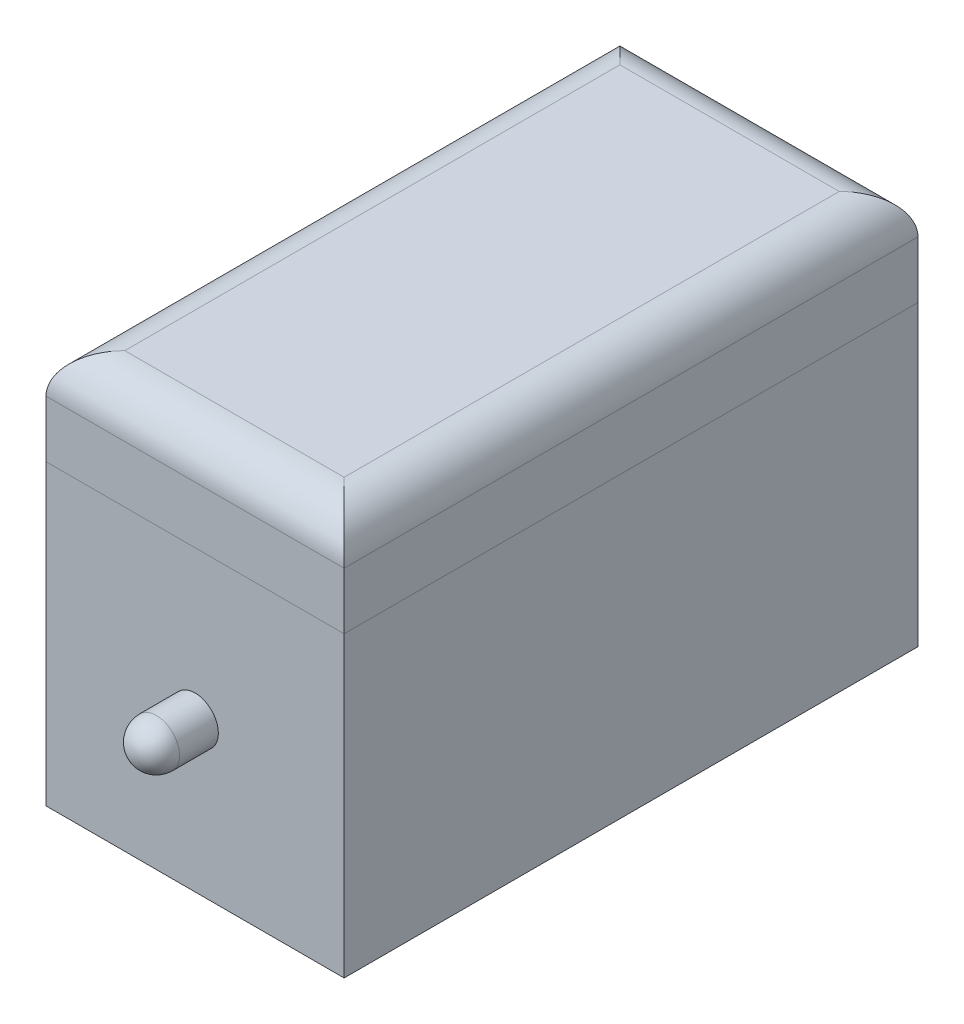
ISO-10303-21;
HEADER;
FILE_DESCRIPTION(('STEP AP214'),'2;1');
FILE_NAME('part.step','',(''),(''),'','','');
FILE_SCHEMA(('AUTOMOTIVE_DESIGN { 1 0 10303 214 1 1 1 1 }'));
ENDSEC;
DATA;
#1=APPLICATION_CONTEXT('core data for automotive mechanical design processes');
#2=APPLICATION_PROTOCOL_DEFINITION('international standard','automotive_design',2000,#1);
#3=PRODUCT_CONTEXT('',#1,'mechanical');
#4=PRODUCT('Part','Part','',(#3));
#5=PRODUCT_RELATED_PRODUCT_CATEGORY('part','',(#4));
#6=PRODUCT_DEFINITION_FORMATION('','',#4);
#7=PRODUCT_DEFINITION_CONTEXT('part definition',#1,'design');
#8=PRODUCT_DEFINITION('design','',#6,#7);
#9=PRODUCT_DEFINITION_SHAPE('','',#8);
#10=(LENGTH_UNIT() NAMED_UNIT(*) SI_UNIT(.MILLI.,.METRE.));
#11=(NAMED_UNIT(*) PLANE_ANGLE_UNIT() SI_UNIT($,.RADIAN.));
#12=(NAMED_UNIT(*) SI_UNIT($,.STERADIAN.) SOLID_ANGLE_UNIT());
#13=UNCERTAINTY_MEASURE_WITH_UNIT(LENGTH_MEASURE(1.E-05),#10,'distance_accuracy_value','');
#14=(GEOMETRIC_REPRESENTATION_CONTEXT(3) GLOBAL_UNCERTAINTY_ASSIGNED_CONTEXT((#13)) GLOBAL_UNIT_ASSIGNED_CONTEXT((#10,
#11,#12)) REPRESENTATION_CONTEXT('',''));
#15=CARTESIAN_POINT('',(0.,0.,0.));
#16=DIRECTION('',(0.,0.,1.));
#17=DIRECTION('',(1.,0.,0.));
#18=AXIS2_PLACEMENT_3D('',#15,#16,#17);
#19=CARTESIAN_POINT('',(9.60999999999999,15.81,37.));
#20=DIRECTION('',(-1.,0.,0.));
#21=DIRECTION('',(0.,0.,1.));
#22=AXIS2_PLACEMENT_3D('',#19,#20,#21);
#23=PLANE('',#22);
#24=DIRECTION('',(0.,-1.,0.));
#25=VECTOR('',#24,1.);
#26=CARTESIAN_POINT('',(9.60999999999999,15.81,0.));
#27=LINE('',#26,#25);
#28=CARTESIAN_POINT('',(9.60999999999999,13.27,0.));
#29=VERTEX_POINT('',#28);
#30=CARTESIAN_POINT('',(9.60999999999999,9.61,0.));
#31=VERTEX_POINT('',#30);
#32=EDGE_CURVE('E99',#29,#31,#27,.T.);
#33=ORIENTED_EDGE('',*,*,#32,.F.);
#34=DIRECTION('',(0.,0.,-1.));
#35=VECTOR('',#34,1.);
#36=CARTESIAN_POINT('',(9.60999999999999,13.27,37.));
#37=LINE('',#36,#35);
#38=CARTESIAN_POINT('',(9.60999999999999,13.27,37.));
#39=VERTEX_POINT('',#38);
#40=EDGE_CURVE('E12',#29,#39,#37,.F.);
#41=ORIENTED_EDGE('',*,*,#40,.T.);
#42=DIRECTION('',(0.,-1.,0.));
#43=VECTOR('',#42,1.);
#44=CARTESIAN_POINT('',(9.60999999999999,15.81,37.));
#45=LINE('',#44,#43);
#46=CARTESIAN_POINT('',(9.60999999999999,9.61,37.));
#47=VERTEX_POINT('',#46);
#48=EDGE_CURVE('E119',#39,#47,#45,.T.);
#49=ORIENTED_EDGE('',*,*,#48,.T.);
#50=DIRECTION('',(0.,0.,-1.));
#51=VECTOR('',#50,1.);
#52=CARTESIAN_POINT('',(9.60999999999999,9.61,37.));
#53=LINE('',#52,#51);
#54=EDGE_CURVE('E114',#47,#31,#53,.T.);
#55=ORIENTED_EDGE('',*,*,#54,.T.);
#56=EDGE_LOOP('',(#33,#41,#49,#55));
#57=FACE_BOUND('',#56,.T.);
#58=ADVANCED_FACE('F47',(#57),#23,.F.);
#59=CARTESIAN_POINT('',(9.60999999999999,15.81,0.));
#60=DIRECTION('',(0.,0.,1.));
#61=DIRECTION('',(1.,0.,0.));
#62=AXIS2_PLACEMENT_3D('',#59,#60,#61);
#63=PLANE('',#62);
#64=DIRECTION('',(0.,-1.,0.));
#65=VECTOR('',#64,1.);
#66=CARTESIAN_POINT('',(-9.61,15.81,0.));
#67=LINE('',#66,#65);
#68=CARTESIAN_POINT('',(-9.61,13.27,0.));
#69=VERTEX_POINT('',#68);
#70=CARTESIAN_POINT('',(-9.61,9.61,0.));
#71=VERTEX_POINT('',#70);
#72=EDGE_CURVE('E108',#69,#71,#67,.T.);
#73=ORIENTED_EDGE('',*,*,#72,.F.);
#74=DIRECTION('',(-1.,0.,0.));
#75=VECTOR('',#74,1.);
#76=CARTESIAN_POINT('',(9.60999999999999,13.27,0.));
#77=LINE('',#76,#75);
#78=EDGE_CURVE('E56',#69,#29,#77,.F.);
#79=ORIENTED_EDGE('',*,*,#78,.T.);
#80=ORIENTED_EDGE('',*,*,#32,.T.);
#81=DIRECTION('',(-1.,0.,0.));
#82=VECTOR('',#81,1.);
#83=CARTESIAN_POINT('',(9.60999999999999,9.61,0.));
#84=LINE('',#83,#82);
#85=EDGE_CURVE('E102',#31,#71,#84,.T.);
#86=ORIENTED_EDGE('',*,*,#85,.T.);
#87=EDGE_LOOP('',(#73,#79,#80,#86));
#88=FACE_BOUND('',#87,.T.);
#89=ADVANCED_FACE('F101',(#88),#63,.F.);
#90=CARTESIAN_POINT('',(-9.61,15.81,0.));
#91=DIRECTION('',(1.,0.,0.));
#92=DIRECTION('',(0.,0.,-1.));
#93=AXIS2_PLACEMENT_3D('',#90,#91,#92);
#94=PLANE('',#93);
#95=DIRECTION('',(0.,-1.,0.));
#96=VECTOR('',#95,1.);
#97=CARTESIAN_POINT('',(-9.61,15.81,37.));
#98=LINE('',#97,#96);
#99=CARTESIAN_POINT('',(-9.61,13.27,37.));
#100=VERTEX_POINT('',#99);
#101=CARTESIAN_POINT('',(-9.61,9.61,37.));
#102=VERTEX_POINT('',#101);
#103=EDGE_CURVE('E129',#100,#102,#98,.T.);
#104=ORIENTED_EDGE('',*,*,#103,.F.);
#105=DIRECTION('',(0.,0.,1.));
#106=VECTOR('',#105,1.);
#107=CARTESIAN_POINT('',(-9.61,13.27,0.));
#108=LINE('',#107,#106);
#109=EDGE_CURVE('E71',#100,#69,#108,.F.);
#110=ORIENTED_EDGE('',*,*,#109,.T.);
#111=ORIENTED_EDGE('',*,*,#72,.T.);
#112=DIRECTION('',(0.,0.,1.));
#113=VECTOR('',#112,1.);
#114=CARTESIAN_POINT('',(-9.61,9.61,0.));
#115=LINE('',#114,#113);
#116=EDGE_CURVE('E116',#71,#102,#115,.T.);
#117=ORIENTED_EDGE('',*,*,#116,.T.);
#118=EDGE_LOOP('',(#104,#110,#111,#117));
#119=FACE_BOUND('',#118,.T.);
#120=ADVANCED_FACE('F167',(#119),#94,.F.);
#121=CARTESIAN_POINT('',(-9.61,15.81,37.));
#122=DIRECTION('',(0.,0.,-1.));
#123=DIRECTION('',(-1.,0.,0.));
#124=AXIS2_PLACEMENT_3D('',#121,#122,#123);
#125=PLANE('',#124);
#126=ORIENTED_EDGE('',*,*,#48,.F.);
#127=DIRECTION('',(1.,0.,0.));
#128=VECTOR('',#127,1.);
#129=CARTESIAN_POINT('',(-9.61,13.27,37.));
#130=LINE('',#129,#128);
#131=EDGE_CURVE('E140',#39,#100,#130,.F.);
#132=ORIENTED_EDGE('',*,*,#131,.T.);
#133=ORIENTED_EDGE('',*,*,#103,.T.);
#134=DIRECTION('',(1.,0.,0.));
#135=VECTOR('',#134,1.);
#136=CARTESIAN_POINT('',(-9.61,9.61,37.));
#137=LINE('',#136,#135);
#138=EDGE_CURVE('E126',#102,#47,#137,.T.);
#139=ORIENTED_EDGE('',*,*,#138,.T.);
#140=EDGE_LOOP('',(#126,#132,#133,#139));
#141=FACE_BOUND('',#140,.T.);
#142=ADVANCED_FACE('F166',(#141),#125,.F.);
#143=CARTESIAN_POINT('',(0.,15.81,0.));
#144=DIRECTION('',(0.,1.,0.));
#145=DIRECTION('',(0.,0.,1.));
#146=AXIS2_PLACEMENT_3D('',#143,#144,#145);
#147=PLANE('',#146);
#148=DIRECTION('',(0.,0.,1.));
#149=VECTOR('',#148,1.);
#150=CARTESIAN_POINT('',(-7.07,15.81,37.));
#151=LINE('',#150,#149);
#152=CARTESIAN_POINT('',(-7.07,15.81,2.54));
#153=VERTEX_POINT('',#152);
#154=CARTESIAN_POINT('',(-7.07,15.81,34.46));
#155=VERTEX_POINT('',#154);
#156=EDGE_CURVE('E135',#153,#155,#151,.T.);
#157=ORIENTED_EDGE('',*,*,#156,.T.);
#158=DIRECTION('',(1.,0.,0.));
#159=VECTOR('',#158,1.);
#160=CARTESIAN_POINT('',(9.60999999999999,15.81,34.46));
#161=LINE('',#160,#159);
#162=CARTESIAN_POINT('',(7.06999999999999,15.81,34.46));
#163=VERTEX_POINT('',#162);
#164=EDGE_CURVE('E137',#155,#163,#161,.T.);
#165=ORIENTED_EDGE('',*,*,#164,.T.);
#166=DIRECTION('',(0.,0.,-1.));
#167=VECTOR('',#166,1.);
#168=CARTESIAN_POINT('',(7.06999999999999,15.81,0.));
#169=LINE('',#168,#167);
#170=CARTESIAN_POINT('',(7.06999999999999,15.81,2.54));
#171=VERTEX_POINT('',#170);
#172=EDGE_CURVE('E107',#163,#171,#169,.T.);
#173=ORIENTED_EDGE('',*,*,#172,.T.);
#174=DIRECTION('',(-1.,0.,0.));
#175=VECTOR('',#174,1.);
#176=CARTESIAN_POINT('',(-9.61,15.81,2.54));
#177=LINE('',#176,#175);
#178=EDGE_CURVE('E133',#171,#153,#177,.T.);
#179=ORIENTED_EDGE('',*,*,#178,.T.);
#180=EDGE_LOOP('',(#157,#165,#173,#179));
#181=FACE_BOUND('',#180,.T.);
#182=ADVANCED_FACE('F159',(#181),#147,.T.);
#183=CARTESIAN_POINT('',(0.,9.61,0.));
#184=DIRECTION('',(0.,1.,0.));
#185=DIRECTION('',(0.,0.,1.));
#186=AXIS2_PLACEMENT_3D('',#183,#184,#185);
#187=PLANE('',#186);
#188=ORIENTED_EDGE('',*,*,#54,.F.);
#189=ORIENTED_EDGE('',*,*,#138,.F.);
#190=ORIENTED_EDGE('',*,*,#116,.F.);
#191=ORIENTED_EDGE('',*,*,#85,.F.);
#192=EDGE_LOOP('',(#188,#189,#190,#191));
#193=FACE_BOUND('',#192,.T.);
#194=ADVANCED_FACE('F112',(#193),#187,.F.);
#195=CARTESIAN_POINT('',(0.,13.27,2.54));
#196=DIRECTION('',(1.,0.,0.));
#197=DIRECTION('',(0.,0.,-1.));
#198=AXIS2_PLACEMENT_3D('',#195,#196,#197);
#199=CYLINDRICAL_SURFACE('',#198,2.54);
#200=CARTESIAN_POINT('',(7.06999999999999,13.27,2.54));
#201=DIRECTION('',(0.707106781186547,0.,0.707106781186547));
#202=DIRECTION('',(-0.707106781186547,0.,0.707106781186547));
#203=AXIS2_PLACEMENT_3D('',#200,#201,#202);
#204=ELLIPSE('',#203,3.59210244842766,2.54);
#205=EDGE_CURVE('E123',#29,#171,#204,.T.);
#206=ORIENTED_EDGE('',*,*,#205,.F.);
#207=ORIENTED_EDGE('',*,*,#78,.F.);
#208=CARTESIAN_POINT('',(-7.07,13.27,2.54));
#209=DIRECTION('',(0.707106781186547,0.,-0.707106781186547));
#210=DIRECTION('',(0.707106781186547,0.,0.707106781186547));
#211=AXIS2_PLACEMENT_3D('',#208,#209,#210);
#212=ELLIPSE('',#211,3.59210244842766,2.54);
#213=EDGE_CURVE('E51',#153,#69,#212,.F.);
#214=ORIENTED_EDGE('',*,*,#213,.F.);
#215=ORIENTED_EDGE('',*,*,#178,.F.);
#216=EDGE_LOOP('',(#206,#207,#214,#215));
#217=FACE_BOUND('',#216,.T.);
#218=ADVANCED_FACE('F49',(#217),#199,.T.);
#219=CARTESIAN_POINT('',(-7.07,13.27,0.));
#220=DIRECTION('',(0.,0.,-1.));
#221=DIRECTION('',(-1.,0.,0.));
#222=AXIS2_PLACEMENT_3D('',#219,#220,#221);
#223=CYLINDRICAL_SURFACE('',#222,2.54);
#224=ORIENTED_EDGE('',*,*,#213,.T.);
#225=ORIENTED_EDGE('',*,*,#109,.F.);
#226=CARTESIAN_POINT('',(-7.07,13.27,34.46));
#227=DIRECTION('',(-0.707106781186547,0.,-0.707106781186547));
#228=DIRECTION('',(0.707106781186547,0.,-0.707106781186547));
#229=AXIS2_PLACEMENT_3D('',#226,#227,#228);
#230=ELLIPSE('',#229,3.59210244842766,2.54);
#231=EDGE_CURVE('E147',#155,#100,#230,.F.);
#232=ORIENTED_EDGE('',*,*,#231,.F.);
#233=ORIENTED_EDGE('',*,*,#156,.F.);
#234=EDGE_LOOP('',(#224,#225,#232,#233));
#235=FACE_BOUND('',#234,.T.);
#236=ADVANCED_FACE('F184',(#235),#223,.T.);
#237=CARTESIAN_POINT('',(7.06999999999999,13.27,0.));
#238=DIRECTION('',(0.,0.,1.));
#239=DIRECTION('',(1.,0.,0.));
#240=AXIS2_PLACEMENT_3D('',#237,#238,#239);
#241=CYLINDRICAL_SURFACE('',#240,2.54);
#242=ORIENTED_EDGE('',*,*,#205,.T.);
#243=ORIENTED_EDGE('',*,*,#172,.F.);
#244=CARTESIAN_POINT('',(7.06999999999999,13.27,34.46));
#245=DIRECTION('',(-0.707106781186547,0.,0.707106781186547));
#246=DIRECTION('',(0.707106781186547,0.,0.707106781186547));
#247=AXIS2_PLACEMENT_3D('',#244,#245,#246);
#248=ELLIPSE('',#247,3.59210244842766,2.54);
#249=EDGE_CURVE('E145',#39,#163,#248,.T.);
#250=ORIENTED_EDGE('',*,*,#249,.F.);
#251=ORIENTED_EDGE('',*,*,#40,.F.);
#252=EDGE_LOOP('',(#242,#243,#250,#251));
#253=FACE_BOUND('',#252,.T.);
#254=ADVANCED_FACE('F152',(#253),#241,.T.);
#255=CARTESIAN_POINT('',(0.,13.27,34.46));
#256=DIRECTION('',(-1.,0.,0.));
#257=DIRECTION('',(0.,0.,1.));
#258=AXIS2_PLACEMENT_3D('',#255,#256,#257);
#259=CYLINDRICAL_SURFACE('',#258,2.54);
#260=ORIENTED_EDGE('',*,*,#231,.T.);
#261=ORIENTED_EDGE('',*,*,#131,.F.);
#262=ORIENTED_EDGE('',*,*,#249,.T.);
#263=ORIENTED_EDGE('',*,*,#164,.F.);
#264=EDGE_LOOP('',(#260,#261,#262,#263));
#265=FACE_BOUND('',#264,.T.);
#266=ADVANCED_FACE('F163',(#265),#259,.T.);
#267=CLOSED_SHELL('',(#58,#89,#120,#142,#182,#194,#218,#236,#254,#266));
#268=MANIFOLD_SOLID_BREP('B2',#267);
#269=CARTESIAN_POINT('',(0.,0.,37.));
#270=DIRECTION('',(0.,0.,1.));
#271=DIRECTION('',(1.,0.,0.));
#272=AXIS2_PLACEMENT_3D('',#269,#270,#271);
#273=PLANE('',#272);
#274=DIRECTION('',(0.,1.,0.));
#275=VECTOR('',#274,1.);
#276=CARTESIAN_POINT('',(9.60999999999999,9.61,37.));
#277=LINE('',#276,#275);
#278=CARTESIAN_POINT('',(9.61,-9.61,37.));
#279=VERTEX_POINT('',#278);
#280=CARTESIAN_POINT('',(9.60999999999999,9.61,37.));
#281=VERTEX_POINT('',#280);
#282=EDGE_CURVE('E304',#279,#281,#277,.T.);
#283=ORIENTED_EDGE('',*,*,#282,.T.);
#284=DIRECTION('',(-1.,0.,0.));
#285=VECTOR('',#284,1.);
#286=CARTESIAN_POINT('',(-9.61,9.61,37.));
#287=LINE('',#286,#285);
#288=CARTESIAN_POINT('',(-9.61,9.61,37.));
#289=VERTEX_POINT('',#288);
#290=EDGE_CURVE('E299',#281,#289,#287,.T.);
#291=ORIENTED_EDGE('',*,*,#290,.T.);
#292=DIRECTION('',(0.,-1.,0.));
#293=VECTOR('',#292,1.);
#294=CARTESIAN_POINT('',(-9.61,9.61,37.));
#295=LINE('',#294,#293);
#296=CARTESIAN_POINT('',(-9.61,-9.61,37.));
#297=VERTEX_POINT('',#296);
#298=EDGE_CURVE('E302',#289,#297,#295,.T.);
#299=ORIENTED_EDGE('',*,*,#298,.T.);
#300=DIRECTION('',(1.,0.,0.));
#301=VECTOR('',#300,1.);
#302=CARTESIAN_POINT('',(-9.61,-9.61,37.));
#303=LINE('',#302,#301);
#304=EDGE_CURVE('E269',#297,#279,#303,.T.);
#305=ORIENTED_EDGE('',*,*,#304,.T.);
#306=EDGE_LOOP('',(#283,#291,#299,#305));
#307=FACE_BOUND('',#306,.T.);
#308=CARTESIAN_POINT('',(0.,0.,37.));
#309=DIRECTION('',(0.,0.,1.));
#310=DIRECTION('',(1.,0.,0.));
#311=AXIS2_PLACEMENT_3D('',#308,#309,#310);
#312=CIRCLE('',#311,1.5);
#313=CARTESIAN_POINT('',(1.5,0.,37.));
#314=VERTEX_POINT('',#313);
#315=EDGE_CURVE('E331',#314,#314,#312,.T.);
#316=ORIENTED_EDGE('',*,*,#315,.F.);
#317=EDGE_LOOP('',(#316));
#318=FACE_BOUND('',#317,.T.);
#319=ADVANCED_FACE('F251',(#307,#318),#273,.T.);
#320=CARTESIAN_POINT('',(9.60999999999999,9.61,37.));
#321=DIRECTION('',(-1.,0.,0.));
#322=DIRECTION('',(0.,-1.,0.));
#323=AXIS2_PLACEMENT_3D('',#320,#321,#322);
#324=PLANE('',#323);
#325=DIRECTION('',(0.,1.,0.));
#326=VECTOR('',#325,1.);
#327=CARTESIAN_POINT('',(9.60999999999999,9.61,0.));
#328=LINE('',#327,#326);
#329=CARTESIAN_POINT('',(9.61,-9.61,0.));
#330=VERTEX_POINT('',#329);
#331=CARTESIAN_POINT('',(9.60999999999999,9.61,0.));
#332=VERTEX_POINT('',#331);
#333=EDGE_CURVE('E317',#330,#332,#328,.T.);
#334=ORIENTED_EDGE('',*,*,#333,.T.);
#335=DIRECTION('',(0.,0.,-1.));
#336=VECTOR('',#335,1.);
#337=CARTESIAN_POINT('',(9.60999999999999,9.61,37.));
#338=LINE('',#337,#336);
#339=EDGE_CURVE('E45',#281,#332,#338,.T.);
#340=ORIENTED_EDGE('',*,*,#339,.F.);
#341=ORIENTED_EDGE('',*,*,#282,.F.);
#342=DIRECTION('',(0.,0.,-1.));
#343=VECTOR('',#342,1.);
#344=CARTESIAN_POINT('',(9.61,-9.61,37.));
#345=LINE('',#344,#343);
#346=EDGE_CURVE('E313',#279,#330,#345,.T.);
#347=ORIENTED_EDGE('',*,*,#346,.T.);
#348=EDGE_LOOP('',(#334,#340,#341,#347));
#349=FACE_BOUND('',#348,.T.);
#350=ADVANCED_FACE('F329',(#349),#324,.F.);
#351=CARTESIAN_POINT('',(-9.61,9.61,37.));
#352=DIRECTION('',(0.,-1.,0.));
#353=DIRECTION('',(0.,0.,-1.));
#354=AXIS2_PLACEMENT_3D('',#351,#352,#353);
#355=PLANE('',#354);
#356=DIRECTION('',(-1.,0.,0.));
#357=VECTOR('',#356,1.);
#358=CARTESIAN_POINT('',(-9.61,9.61,0.));
#359=LINE('',#358,#357);
#360=CARTESIAN_POINT('',(-9.61,9.61,0.));
#361=VERTEX_POINT('',#360);
#362=EDGE_CURVE('E308',#332,#361,#359,.T.);
#363=ORIENTED_EDGE('',*,*,#362,.T.);
#364=DIRECTION('',(0.,0.,-1.));
#365=VECTOR('',#364,1.);
#366=CARTESIAN_POINT('',(-9.61,9.61,37.));
#367=LINE('',#366,#365);
#368=EDGE_CURVE('E261',#289,#361,#367,.T.);
#369=ORIENTED_EDGE('',*,*,#368,.F.);
#370=ORIENTED_EDGE('',*,*,#290,.F.);
#371=ORIENTED_EDGE('',*,*,#339,.T.);
#372=EDGE_LOOP('',(#363,#369,#370,#371));
#373=FACE_BOUND('',#372,.T.);
#374=ADVANCED_FACE('F307',(#373),#355,.F.);
#375=CARTESIAN_POINT('',(-9.61,9.61,37.));
#376=DIRECTION('',(1.,0.,0.));
#377=DIRECTION('',(0.,1.,0.));
#378=AXIS2_PLACEMENT_3D('',#375,#376,#377);
#379=PLANE('',#378);
#380=DIRECTION('',(0.,-1.,0.));
#381=VECTOR('',#380,1.);
#382=CARTESIAN_POINT('',(-9.61,9.61,0.));
#383=LINE('',#382,#381);
#384=CARTESIAN_POINT('',(-9.61,-9.61,0.));
#385=VERTEX_POINT('',#384);
#386=EDGE_CURVE('E286',#361,#385,#383,.T.);
#387=ORIENTED_EDGE('',*,*,#386,.T.);
#388=DIRECTION('',(0.,0.,-1.));
#389=VECTOR('',#388,1.);
#390=CARTESIAN_POINT('',(-9.61,-9.61,37.));
#391=LINE('',#390,#389);
#392=EDGE_CURVE('E309',#297,#385,#391,.T.);
#393=ORIENTED_EDGE('',*,*,#392,.F.);
#394=ORIENTED_EDGE('',*,*,#298,.F.);
#395=ORIENTED_EDGE('',*,*,#368,.T.);
#396=EDGE_LOOP('',(#387,#393,#394,#395));
#397=FACE_BOUND('',#396,.T.);
#398=ADVANCED_FACE('F311',(#397),#379,.F.);
#399=CARTESIAN_POINT('',(-9.61,-9.61,37.));
#400=DIRECTION('',(0.,1.,0.));
#401=DIRECTION('',(0.,0.,1.));
#402=AXIS2_PLACEMENT_3D('',#399,#400,#401);
#403=PLANE('',#402);
#404=DIRECTION('',(1.,0.,0.));
#405=VECTOR('',#404,1.);
#406=CARTESIAN_POINT('',(-9.61,-9.61,0.));
#407=LINE('',#406,#405);
#408=EDGE_CURVE('E292',#385,#330,#407,.T.);
#409=ORIENTED_EDGE('',*,*,#408,.T.);
#410=ORIENTED_EDGE('',*,*,#346,.F.);
#411=ORIENTED_EDGE('',*,*,#304,.F.);
#412=ORIENTED_EDGE('',*,*,#392,.T.);
#413=EDGE_LOOP('',(#409,#410,#411,#412));
#414=FACE_BOUND('',#413,.T.);
#415=ADVANCED_FACE('F324',(#414),#403,.F.);
#416=CARTESIAN_POINT('',(0.,0.,0.));
#417=DIRECTION('',(0.,0.,1.));
#418=DIRECTION('',(1.,0.,0.));
#419=AXIS2_PLACEMENT_3D('',#416,#417,#418);
#420=PLANE('',#419);
#421=ORIENTED_EDGE('',*,*,#333,.F.);
#422=ORIENTED_EDGE('',*,*,#408,.F.);
#423=ORIENTED_EDGE('',*,*,#386,.F.);
#424=ORIENTED_EDGE('',*,*,#362,.F.);
#425=EDGE_LOOP('',(#421,#422,#423,#424));
#426=FACE_BOUND('',#425,.T.);
#427=ADVANCED_FACE('F327',(#426),#420,.F.);
#428=CARTESIAN_POINT('',(0.,0.,39.5));
#429=DIRECTION('',(0.,0.,-1.));
#430=DIRECTION('',(-1.,0.,0.));
#431=AXIS2_PLACEMENT_3D('',#428,#429,#430);
#432=CYLINDRICAL_SURFACE('',#431,1.5);
#433=CARTESIAN_POINT('',(0.,0.,39.5));
#434=DIRECTION('',(0.,0.,1.));
#435=DIRECTION('',(1.,0.,0.));
#436=AXIS2_PLACEMENT_3D('',#433,#434,#435);
#437=CIRCLE('',#436,1.5);
#438=CARTESIAN_POINT('',(1.5,0.,39.5));
#439=VERTEX_POINT('',#438);
#440=EDGE_CURVE('E255',#439,#439,#437,.T.);
#441=ORIENTED_EDGE('',*,*,#440,.F.);
#442=EDGE_LOOP('',(#441));
#443=FACE_BOUND('',#442,.T.);
#444=ORIENTED_EDGE('',*,*,#315,.T.);
#445=EDGE_LOOP('',(#444));
#446=FACE_BOUND('',#445,.T.);
#447=ADVANCED_FACE('F339',(#443,#446),#432,.T.);
#448=CARTESIAN_POINT('',(0.,0.,39.5));
#449=DIRECTION('',(0.,0.,1.));
#450=DIRECTION('',(1.,0.,0.));
#451=AXIS2_PLACEMENT_3D('',#448,#449,#450);
#452=SPHERICAL_SURFACE('',#451,1.5);
#453=ORIENTED_EDGE('',*,*,#440,.T.);
#454=EDGE_LOOP('',(#453));
#455=FACE_BOUND('',#454,.T.);
#456=ADVANCED_FACE('F253',(#455),#452,.T.);
#457=CLOSED_SHELL('',(#319,#350,#374,#398,#415,#427,#447,#456));
#458=MANIFOLD_SOLID_BREP('B6',#457);
#459=ADVANCED_BREP_SHAPE_REPRESENTATION('',(#18,#268,#458),#14);
#460=SHAPE_DEFINITION_REPRESENTATION(#9,#459);
ENDSEC;
END-ISO-10303-21;
